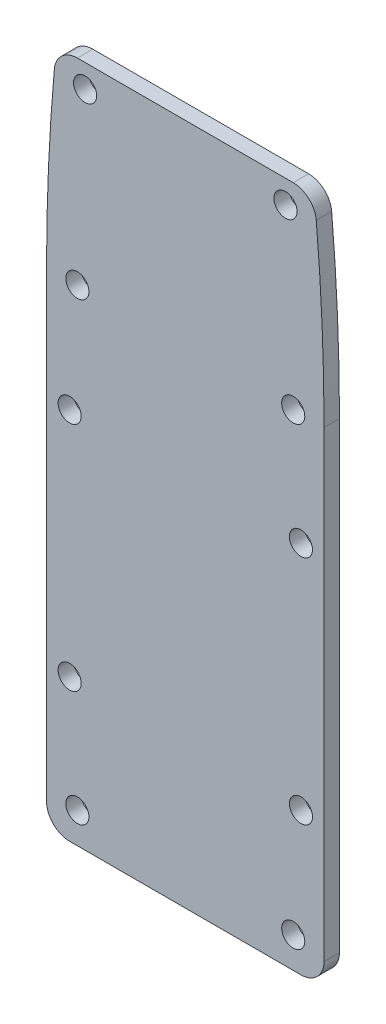
ISO-10303-21;
HEADER;
FILE_DESCRIPTION(('STEP AP214'),'2;1');
FILE_NAME('part.step','',(''),(''),'','','');
FILE_SCHEMA(('AUTOMOTIVE_DESIGN { 1 0 10303 214 1 1 1 1 }'));
ENDSEC;
DATA;
#1=APPLICATION_CONTEXT('core data for automotive mechanical design processes');
#2=APPLICATION_PROTOCOL_DEFINITION('international standard','automotive_design',2000,#1);
#3=PRODUCT_CONTEXT('',#1,'mechanical');
#4=PRODUCT('Part','Part','',(#3));
#5=PRODUCT_RELATED_PRODUCT_CATEGORY('part','',(#4));
#6=PRODUCT_DEFINITION_FORMATION('','',#4);
#7=PRODUCT_DEFINITION_CONTEXT('part definition',#1,'design');
#8=PRODUCT_DEFINITION('design','',#6,#7);
#9=PRODUCT_DEFINITION_SHAPE('','',#8);
#10=(LENGTH_UNIT() NAMED_UNIT(*) SI_UNIT(.MILLI.,.METRE.));
#11=(NAMED_UNIT(*) PLANE_ANGLE_UNIT() SI_UNIT($,.RADIAN.));
#12=(NAMED_UNIT(*) SI_UNIT($,.STERADIAN.) SOLID_ANGLE_UNIT());
#13=UNCERTAINTY_MEASURE_WITH_UNIT(LENGTH_MEASURE(1.E-05),#10,'distance_accuracy_value','');
#14=(GEOMETRIC_REPRESENTATION_CONTEXT(3) GLOBAL_UNCERTAINTY_ASSIGNED_CONTEXT((#13)) GLOBAL_UNIT_ASSIGNED_CONTEXT((#10,
#11,#12)) REPRESENTATION_CONTEXT('',''));
#15=CARTESIAN_POINT('',(0.,0.,0.));
#16=DIRECTION('',(0.,0.,1.));
#17=DIRECTION('',(1.,0.,0.));
#18=AXIS2_PLACEMENT_3D('',#15,#16,#17);
#19=CARTESIAN_POINT('',(238.624999999994,29.5000000000001,2.));
#20=DIRECTION('',(0.,0.,-1.));
#21=DIRECTION('',(-1.,0.,0.));
#22=AXIS2_PLACEMENT_3D('',#19,#20,#21);
#23=PLANE('',#22);
#24=DIRECTION('',(1.,0.,0.));
#25=VECTOR('',#24,1.);
#26=CARTESIAN_POINT('',(-18.,-33.5,2.));
#27=LINE('',#26,#25);
#28=CARTESIAN_POINT('',(-15.,-33.5,2.));
#29=VERTEX_POINT('',#28);
#30=CARTESIAN_POINT('',(15.,-33.5,2.));
#31=VERTEX_POINT('',#30);
#32=EDGE_CURVE('E129',#29,#31,#27,.T.);
#33=ORIENTED_EDGE('',*,*,#32,.T.);
#34=CARTESIAN_POINT('',(15.,-30.5,2.));
#35=DIRECTION('',(0.,0.,-1.));
#36=DIRECTION('',(-1.,0.,0.));
#37=AXIS2_PLACEMENT_3D('',#34,#35,#36);
#38=CIRCLE('',#37,3.);
#39=CARTESIAN_POINT('',(18.,-30.5,2.));
#40=VERTEX_POINT('',#39);
#41=EDGE_CURVE('E52',#31,#40,#38,.F.);
#42=ORIENTED_EDGE('',*,*,#41,.T.);
#43=DIRECTION('',(0.,1.,0.));
#44=VECTOR('',#43,1.);
#45=CARTESIAN_POINT('',(18.,29.5,2.));
#46=LINE('',#45,#44);
#47=CARTESIAN_POINT('',(18.,29.5,2.));
#48=VERTEX_POINT('',#47);
#49=EDGE_CURVE('E175',#40,#48,#46,.T.);
#50=ORIENTED_EDGE('',*,*,#49,.T.);
#51=CARTESIAN_POINT('',(-238.624999999994,29.5000000000001,2.));
#52=DIRECTION('',(0.,0.,1.));
#53=DIRECTION('',(1.,0.,0.));
#54=AXIS2_PLACEMENT_3D('',#51,#52,#53);
#55=CIRCLE('',#54,256.624999999994);
#56=CARTESIAN_POINT('',(16.9881715130605,52.2661409561361,2.));
#57=VERTEX_POINT('',#56);
#58=EDGE_CURVE('E184',#48,#57,#55,.T.);
#59=ORIENTED_EDGE('',*,*,#58,.T.);
#60=CARTESIAN_POINT('',(14.,52.,2.));
#61=DIRECTION('',(0.,0.,1.));
#62=DIRECTION('',(-1.,0.,0.));
#63=AXIS2_PLACEMENT_3D('',#60,#61,#62);
#64=CIRCLE('',#63,2.99999999999996);
#65=CARTESIAN_POINT('',(14.,55.,2.));
#66=VERTEX_POINT('',#65);
#67=EDGE_CURVE('E234',#57,#66,#64,.T.);
#68=ORIENTED_EDGE('',*,*,#67,.T.);
#69=DIRECTION('',(-1.,0.,0.));
#70=VECTOR('',#69,1.);
#71=CARTESIAN_POINT('',(-14.,55.,2.));
#72=LINE('',#71,#70);
#73=CARTESIAN_POINT('',(-14.,55.,2.));
#74=VERTEX_POINT('',#73);
#75=EDGE_CURVE('E245',#66,#74,#72,.T.);
#76=ORIENTED_EDGE('',*,*,#75,.T.);
#77=CARTESIAN_POINT('',(-14.,52.,2.));
#78=DIRECTION('',(0.,0.,1.));
#79=DIRECTION('',(1.,0.,0.));
#80=AXIS2_PLACEMENT_3D('',#77,#78,#79);
#81=CIRCLE('',#80,2.99999999999996);
#82=CARTESIAN_POINT('',(-16.9881715130606,52.266140956136,2.));
#83=VERTEX_POINT('',#82);
#84=EDGE_CURVE('E135',#74,#83,#81,.T.);
#85=ORIENTED_EDGE('',*,*,#84,.T.);
#86=CARTESIAN_POINT('',(238.624999999994,29.5000000000001,2.));
#87=DIRECTION('',(0.,0.,1.));
#88=DIRECTION('',(-1.,0.,0.));
#89=AXIS2_PLACEMENT_3D('',#86,#87,#88);
#90=CIRCLE('',#89,256.624999999994);
#91=CARTESIAN_POINT('',(-18.,29.5,2.));
#92=VERTEX_POINT('',#91);
#93=EDGE_CURVE('E130',#83,#92,#90,.T.);
#94=ORIENTED_EDGE('',*,*,#93,.T.);
#95=DIRECTION('',(0.,-1.,0.));
#96=VECTOR('',#95,1.);
#97=CARTESIAN_POINT('',(-18.,29.5,2.));
#98=LINE('',#97,#96);
#99=CARTESIAN_POINT('',(-18.,-30.5,2.));
#100=VERTEX_POINT('',#99);
#101=EDGE_CURVE('E120',#92,#100,#98,.T.);
#102=ORIENTED_EDGE('',*,*,#101,.T.);
#103=CARTESIAN_POINT('',(-15.,-30.5,2.));
#104=DIRECTION('',(0.,0.,-1.));
#105=DIRECTION('',(-1.,0.,0.));
#106=AXIS2_PLACEMENT_3D('',#103,#104,#105);
#107=CIRCLE('',#106,3.);
#108=EDGE_CURVE('E170',#100,#29,#107,.F.);
#109=ORIENTED_EDGE('',*,*,#108,.T.);
#110=EDGE_LOOP('',(#33,#42,#50,#59,#68,#76,#85,#94,#102,#109));
#111=FACE_BOUND('',#110,.T.);
#112=CARTESIAN_POINT('',(14.,29.5,2.));
#113=DIRECTION('',(0.,0.,1.));
#114=DIRECTION('',(1.,0.,0.));
#115=AXIS2_PLACEMENT_3D('',#112,#113,#114);
#116=CIRCLE('',#115,1.5);
#117=CARTESIAN_POINT('',(15.5,29.5,2.));
#118=VERTEX_POINT('',#117);
#119=EDGE_CURVE('E251',#118,#118,#116,.T.);
#120=ORIENTED_EDGE('',*,*,#119,.F.);
#121=EDGE_LOOP('',(#120));
#122=FACE_BOUND('',#121,.T.);
#123=CARTESIAN_POINT('',(-13.,52.,2.));
#124=DIRECTION('',(0.,0.,1.));
#125=DIRECTION('',(1.,0.,0.));
#126=AXIS2_PLACEMENT_3D('',#123,#124,#125);
#127=CIRCLE('',#126,1.5);
#128=CARTESIAN_POINT('',(-11.5,52.,2.));
#129=VERTEX_POINT('',#128);
#130=EDGE_CURVE('E260',#129,#129,#127,.T.);
#131=ORIENTED_EDGE('',*,*,#130,.F.);
#132=EDGE_LOOP('',(#131));
#133=FACE_BOUND('',#132,.T.);
#134=CARTESIAN_POINT('',(-14.,29.5,2.));
#135=DIRECTION('',(0.,0.,1.));
#136=DIRECTION('',(1.,0.,0.));
#137=AXIS2_PLACEMENT_3D('',#134,#135,#136);
#138=CIRCLE('',#137,1.5);
#139=CARTESIAN_POINT('',(-12.5,29.5,2.));
#140=VERTEX_POINT('',#139);
#141=EDGE_CURVE('E550',#140,#140,#138,.T.);
#142=ORIENTED_EDGE('',*,*,#141,.F.);
#143=EDGE_LOOP('',(#142));
#144=FACE_BOUND('',#143,.T.);
#145=CARTESIAN_POINT('',(-14.,-29.5,2.));
#146=DIRECTION('',(0.,0.,1.));
#147=DIRECTION('',(1.,0.,0.));
#148=AXIS2_PLACEMENT_3D('',#145,#146,#147);
#149=CIRCLE('',#148,1.5);
#150=CARTESIAN_POINT('',(-12.5,-29.5,2.));
#151=VERTEX_POINT('',#150);
#152=EDGE_CURVE('E542',#151,#151,#149,.T.);
#153=ORIENTED_EDGE('',*,*,#152,.F.);
#154=EDGE_LOOP('',(#153));
#155=FACE_BOUND('',#154,.T.);
#156=CARTESIAN_POINT('',(14.,-29.5,2.));
#157=DIRECTION('',(0.,0.,1.));
#158=DIRECTION('',(1.,0.,0.));
#159=AXIS2_PLACEMENT_3D('',#156,#157,#158);
#160=CIRCLE('',#159,1.5);
#161=CARTESIAN_POINT('',(15.5,-29.5,2.));
#162=VERTEX_POINT('',#161);
#163=EDGE_CURVE('E534',#162,#162,#160,.T.);
#164=ORIENTED_EDGE('',*,*,#163,.F.);
#165=EDGE_LOOP('',(#164));
#166=FACE_BOUND('',#165,.T.);
#167=CARTESIAN_POINT('',(15.,14.9999999999999,2.));
#168=DIRECTION('',(0.,0.,1.));
#169=DIRECTION('',(1.,0.,0.));
#170=AXIS2_PLACEMENT_3D('',#167,#168,#169);
#171=CIRCLE('',#170,1.5);
#172=CARTESIAN_POINT('',(16.5,14.9999999999999,2.));
#173=VERTEX_POINT('',#172);
#174=EDGE_CURVE('E526',#173,#173,#171,.T.);
#175=ORIENTED_EDGE('',*,*,#174,.F.);
#176=EDGE_LOOP('',(#175));
#177=FACE_BOUND('',#176,.T.);
#178=CARTESIAN_POINT('',(13.,52.,2.));
#179=DIRECTION('',(0.,0.,1.));
#180=DIRECTION('',(1.,0.,0.));
#181=AXIS2_PLACEMENT_3D('',#178,#179,#180);
#182=CIRCLE('',#181,1.5);
#183=CARTESIAN_POINT('',(14.5,52.,2.));
#184=VERTEX_POINT('',#183);
#185=EDGE_CURVE('E518',#184,#184,#182,.T.);
#186=ORIENTED_EDGE('',*,*,#185,.F.);
#187=EDGE_LOOP('',(#186));
#188=FACE_BOUND('',#187,.T.);
#189=CARTESIAN_POINT('',(14.9999999999999,-15.,2.));
#190=DIRECTION('',(0.,0.,1.));
#191=DIRECTION('',(1.,0.,0.));
#192=AXIS2_PLACEMENT_3D('',#189,#190,#191);
#193=CIRCLE('',#192,1.5);
#194=CARTESIAN_POINT('',(16.5,-15.,2.));
#195=VERTEX_POINT('',#194);
#196=EDGE_CURVE('E510',#195,#195,#193,.T.);
#197=ORIENTED_EDGE('',*,*,#196,.F.);
#198=EDGE_LOOP('',(#197));
#199=FACE_BOUND('',#198,.T.);
#200=CARTESIAN_POINT('',(-15.,-14.9999999999999,2.));
#201=DIRECTION('',(0.,0.,1.));
#202=DIRECTION('',(1.,0.,0.));
#203=AXIS2_PLACEMENT_3D('',#200,#201,#202);
#204=CIRCLE('',#203,1.5);
#205=CARTESIAN_POINT('',(-13.5,-14.9999999999999,2.));
#206=VERTEX_POINT('',#205);
#207=EDGE_CURVE('E502',#206,#206,#204,.T.);
#208=ORIENTED_EDGE('',*,*,#207,.F.);
#209=EDGE_LOOP('',(#208));
#210=FACE_BOUND('',#209,.T.);
#211=CARTESIAN_POINT('',(-15.,15.,2.));
#212=DIRECTION('',(0.,0.,1.));
#213=DIRECTION('',(1.,0.,0.));
#214=AXIS2_PLACEMENT_3D('',#211,#212,#213);
#215=CIRCLE('',#214,1.5);
#216=CARTESIAN_POINT('',(-13.5,15.,2.));
#217=VERTEX_POINT('',#216);
#218=EDGE_CURVE('E491',#217,#217,#215,.T.);
#219=ORIENTED_EDGE('',*,*,#218,.F.);
#220=EDGE_LOOP('',(#219));
#221=FACE_BOUND('',#220,.T.);
#222=ADVANCED_FACE('F43',(#111,#122,#133,#144,#155,#166,#177,#188,#199,#210,#221),#23,.F.);
#223=CARTESIAN_POINT('',(238.624999999994,29.5000000000001,0.));
#224=DIRECTION('',(0.,0.,-1.));
#225=DIRECTION('',(-1.,0.,0.));
#226=AXIS2_PLACEMENT_3D('',#223,#224,#225);
#227=PLANE('',#226);
#228=CARTESIAN_POINT('',(-15.,-14.9999999999999,0.));
#229=DIRECTION('',(0.,0.,1.));
#230=DIRECTION('',(1.,0.,0.));
#231=AXIS2_PLACEMENT_3D('',#228,#229,#230);
#232=CIRCLE('',#231,1.5);
#233=CARTESIAN_POINT('',(-13.5,-14.9999999999999,0.));
#234=VERTEX_POINT('',#233);
#235=EDGE_CURVE('E499',#234,#234,#232,.T.);
#236=ORIENTED_EDGE('',*,*,#235,.T.);
#237=EDGE_LOOP('',(#236));
#238=FACE_BOUND('',#237,.T.);
#239=CARTESIAN_POINT('',(13.,52.,0.));
#240=DIRECTION('',(0.,0.,1.));
#241=DIRECTION('',(1.,0.,0.));
#242=AXIS2_PLACEMENT_3D('',#239,#240,#241);
#243=CIRCLE('',#242,1.5);
#244=CARTESIAN_POINT('',(14.5,52.,0.));
#245=VERTEX_POINT('',#244);
#246=EDGE_CURVE('E514',#245,#245,#243,.T.);
#247=ORIENTED_EDGE('',*,*,#246,.T.);
#248=EDGE_LOOP('',(#247));
#249=FACE_BOUND('',#248,.T.);
#250=CARTESIAN_POINT('',(14.,-29.5,0.));
#251=DIRECTION('',(0.,0.,1.));
#252=DIRECTION('',(1.,0.,0.));
#253=AXIS2_PLACEMENT_3D('',#250,#251,#252);
#254=CIRCLE('',#253,1.5);
#255=CARTESIAN_POINT('',(15.5,-29.5,0.));
#256=VERTEX_POINT('',#255);
#257=EDGE_CURVE('E530',#256,#256,#254,.T.);
#258=ORIENTED_EDGE('',*,*,#257,.T.);
#259=EDGE_LOOP('',(#258));
#260=FACE_BOUND('',#259,.T.);
#261=CARTESIAN_POINT('',(-14.,29.5,0.));
#262=DIRECTION('',(0.,0.,1.));
#263=DIRECTION('',(1.,0.,0.));
#264=AXIS2_PLACEMENT_3D('',#261,#262,#263);
#265=CIRCLE('',#264,1.5);
#266=CARTESIAN_POINT('',(-12.5,29.5,0.));
#267=VERTEX_POINT('',#266);
#268=EDGE_CURVE('E546',#267,#267,#265,.T.);
#269=ORIENTED_EDGE('',*,*,#268,.T.);
#270=EDGE_LOOP('',(#269));
#271=FACE_BOUND('',#270,.T.);
#272=CARTESIAN_POINT('',(14.,29.5,0.));
#273=DIRECTION('',(0.,0.,1.));
#274=DIRECTION('',(1.,0.,0.));
#275=AXIS2_PLACEMENT_3D('',#272,#273,#274);
#276=CIRCLE('',#275,1.5);
#277=CARTESIAN_POINT('',(15.5,29.5,0.));
#278=VERTEX_POINT('',#277);
#279=EDGE_CURVE('E254',#278,#278,#276,.T.);
#280=ORIENTED_EDGE('',*,*,#279,.T.);
#281=EDGE_LOOP('',(#280));
#282=FACE_BOUND('',#281,.T.);
#283=DIRECTION('',(0.,1.,0.));
#284=VECTOR('',#283,1.);
#285=CARTESIAN_POINT('',(18.,29.5,0.));
#286=LINE('',#285,#284);
#287=CARTESIAN_POINT('',(18.,-30.5,0.));
#288=VERTEX_POINT('',#287);
#289=CARTESIAN_POINT('',(18.,29.5,0.));
#290=VERTEX_POINT('',#289);
#291=EDGE_CURVE('E193',#288,#290,#286,.T.);
#292=ORIENTED_EDGE('',*,*,#291,.F.);
#293=CARTESIAN_POINT('',(15.,-30.5,0.));
#294=DIRECTION('',(0.,0.,-1.));
#295=DIRECTION('',(-1.,0.,0.));
#296=AXIS2_PLACEMENT_3D('',#293,#294,#295);
#297=CIRCLE('',#296,3.);
#298=CARTESIAN_POINT('',(15.,-33.5,0.));
#299=VERTEX_POINT('',#298);
#300=EDGE_CURVE('E161',#288,#299,#297,.T.);
#301=ORIENTED_EDGE('',*,*,#300,.T.);
#302=DIRECTION('',(1.,0.,0.));
#303=VECTOR('',#302,1.);
#304=CARTESIAN_POINT('',(-18.,-33.5,0.));
#305=LINE('',#304,#303);
#306=CARTESIAN_POINT('',(-15.,-33.5,0.));
#307=VERTEX_POINT('',#306);
#308=EDGE_CURVE('E191',#307,#299,#305,.T.);
#309=ORIENTED_EDGE('',*,*,#308,.F.);
#310=CARTESIAN_POINT('',(-15.,-30.5,0.));
#311=DIRECTION('',(0.,0.,-1.));
#312=DIRECTION('',(-1.,0.,0.));
#313=AXIS2_PLACEMENT_3D('',#310,#311,#312);
#314=CIRCLE('',#313,3.);
#315=CARTESIAN_POINT('',(-18.,-30.5,0.));
#316=VERTEX_POINT('',#315);
#317=EDGE_CURVE('E152',#307,#316,#314,.T.);
#318=ORIENTED_EDGE('',*,*,#317,.T.);
#319=DIRECTION('',(0.,-1.,0.));
#320=VECTOR('',#319,1.);
#321=CARTESIAN_POINT('',(-18.,29.5,0.));
#322=LINE('',#321,#320);
#323=CARTESIAN_POINT('',(-18.,29.5,0.));
#324=VERTEX_POINT('',#323);
#325=EDGE_CURVE('E197',#324,#316,#322,.T.);
#326=ORIENTED_EDGE('',*,*,#325,.F.);
#327=CARTESIAN_POINT('',(238.624999999994,29.5000000000001,0.));
#328=DIRECTION('',(0.,0.,1.));
#329=DIRECTION('',(-1.,0.,0.));
#330=AXIS2_PLACEMENT_3D('',#327,#328,#329);
#331=CIRCLE('',#330,256.624999999994);
#332=CARTESIAN_POINT('',(-16.9881715130606,52.266140956136,0.));
#333=VERTEX_POINT('',#332);
#334=EDGE_CURVE('E144',#333,#324,#331,.T.);
#335=ORIENTED_EDGE('',*,*,#334,.F.);
#336=CARTESIAN_POINT('',(-14.,52.,0.));
#337=DIRECTION('',(0.,0.,1.));
#338=DIRECTION('',(1.,0.,0.));
#339=AXIS2_PLACEMENT_3D('',#336,#337,#338);
#340=CIRCLE('',#339,2.99999999999996);
#341=CARTESIAN_POINT('',(-14.,55.,0.));
#342=VERTEX_POINT('',#341);
#343=EDGE_CURVE('E140',#342,#333,#340,.T.);
#344=ORIENTED_EDGE('',*,*,#343,.F.);
#345=DIRECTION('',(-1.,0.,0.));
#346=VECTOR('',#345,1.);
#347=CARTESIAN_POINT('',(-14.,55.,0.));
#348=LINE('',#347,#346);
#349=CARTESIAN_POINT('',(14.,55.,0.));
#350=VERTEX_POINT('',#349);
#351=EDGE_CURVE('E211',#350,#342,#348,.T.);
#352=ORIENTED_EDGE('',*,*,#351,.F.);
#353=CARTESIAN_POINT('',(14.,52.,0.));
#354=DIRECTION('',(0.,0.,1.));
#355=DIRECTION('',(-1.,0.,0.));
#356=AXIS2_PLACEMENT_3D('',#353,#354,#355);
#357=CIRCLE('',#356,2.99999999999996);
#358=CARTESIAN_POINT('',(16.9881715130605,52.2661409561361,0.));
#359=VERTEX_POINT('',#358);
#360=EDGE_CURVE('E208',#359,#350,#357,.T.);
#361=ORIENTED_EDGE('',*,*,#360,.F.);
#362=CARTESIAN_POINT('',(-238.624999999994,29.5000000000001,0.));
#363=DIRECTION('',(0.,0.,1.));
#364=DIRECTION('',(1.,0.,0.));
#365=AXIS2_PLACEMENT_3D('',#362,#363,#364);
#366=CIRCLE('',#365,256.624999999994);
#367=EDGE_CURVE('E201',#290,#359,#366,.T.);
#368=ORIENTED_EDGE('',*,*,#367,.F.);
#369=EDGE_LOOP('',(#292,#301,#309,#318,#326,#335,#344,#352,#361,#368));
#370=FACE_BOUND('',#369,.T.);
#371=CARTESIAN_POINT('',(-13.,52.,0.));
#372=DIRECTION('',(0.,0.,1.));
#373=DIRECTION('',(1.,0.,0.));
#374=AXIS2_PLACEMENT_3D('',#371,#372,#373);
#375=CIRCLE('',#374,1.5);
#376=CARTESIAN_POINT('',(-11.5,52.,0.));
#377=VERTEX_POINT('',#376);
#378=EDGE_CURVE('E263',#377,#377,#375,.T.);
#379=ORIENTED_EDGE('',*,*,#378,.T.);
#380=EDGE_LOOP('',(#379));
#381=FACE_BOUND('',#380,.T.);
#382=CARTESIAN_POINT('',(-14.,-29.5,0.));
#383=DIRECTION('',(0.,0.,1.));
#384=DIRECTION('',(1.,0.,0.));
#385=AXIS2_PLACEMENT_3D('',#382,#383,#384);
#386=CIRCLE('',#385,1.5);
#387=CARTESIAN_POINT('',(-12.5,-29.5,0.));
#388=VERTEX_POINT('',#387);
#389=EDGE_CURVE('E538',#388,#388,#386,.T.);
#390=ORIENTED_EDGE('',*,*,#389,.T.);
#391=EDGE_LOOP('',(#390));
#392=FACE_BOUND('',#391,.T.);
#393=CARTESIAN_POINT('',(15.,14.9999999999999,0.));
#394=DIRECTION('',(0.,0.,1.));
#395=DIRECTION('',(1.,0.,0.));
#396=AXIS2_PLACEMENT_3D('',#393,#394,#395);
#397=CIRCLE('',#396,1.5);
#398=CARTESIAN_POINT('',(16.5,14.9999999999999,0.));
#399=VERTEX_POINT('',#398);
#400=EDGE_CURVE('E522',#399,#399,#397,.T.);
#401=ORIENTED_EDGE('',*,*,#400,.T.);
#402=EDGE_LOOP('',(#401));
#403=FACE_BOUND('',#402,.T.);
#404=CARTESIAN_POINT('',(14.9999999999999,-15.,0.));
#405=DIRECTION('',(0.,0.,1.));
#406=DIRECTION('',(1.,0.,0.));
#407=AXIS2_PLACEMENT_3D('',#404,#405,#406);
#408=CIRCLE('',#407,1.5);
#409=CARTESIAN_POINT('',(16.5,-15.,0.));
#410=VERTEX_POINT('',#409);
#411=EDGE_CURVE('E506',#410,#410,#408,.T.);
#412=ORIENTED_EDGE('',*,*,#411,.T.);
#413=EDGE_LOOP('',(#412));
#414=FACE_BOUND('',#413,.T.);
#415=CARTESIAN_POINT('',(-15.,15.,0.));
#416=DIRECTION('',(0.,0.,1.));
#417=DIRECTION('',(1.,0.,0.));
#418=AXIS2_PLACEMENT_3D('',#415,#416,#417);
#419=CIRCLE('',#418,1.5);
#420=CARTESIAN_POINT('',(-13.5,15.,0.));
#421=VERTEX_POINT('',#420);
#422=EDGE_CURVE('E494',#421,#421,#419,.T.);
#423=ORIENTED_EDGE('',*,*,#422,.T.);
#424=EDGE_LOOP('',(#423));
#425=FACE_BOUND('',#424,.T.);
#426=ADVANCED_FACE('F189',(#238,#249,#260,#271,#282,#370,#381,#392,#403,#414,#425),#227,.T.);
#427=CARTESIAN_POINT('',(238.624999999994,29.5000000000001,2.));
#428=DIRECTION('',(0.,0.,-1.));
#429=DIRECTION('',(-1.,0.,0.));
#430=AXIS2_PLACEMENT_3D('',#427,#428,#429);
#431=CYLINDRICAL_SURFACE('',#430,256.624999999994);
#432=ORIENTED_EDGE('',*,*,#334,.T.);
#433=DIRECTION('',(0.,0.,-1.));
#434=VECTOR('',#433,1.);
#435=CARTESIAN_POINT('',(-18.,29.5,2.));
#436=LINE('',#435,#434);
#437=EDGE_CURVE('E124',#92,#324,#436,.T.);
#438=ORIENTED_EDGE('',*,*,#437,.F.);
#439=ORIENTED_EDGE('',*,*,#93,.F.);
#440=DIRECTION('',(0.,0.,-1.));
#441=VECTOR('',#440,1.);
#442=CARTESIAN_POINT('',(-16.9881715130606,52.266140956136,2.));
#443=LINE('',#442,#441);
#444=EDGE_CURVE('E216',#83,#333,#443,.T.);
#445=ORIENTED_EDGE('',*,*,#444,.T.);
#446=EDGE_LOOP('',(#432,#438,#439,#445));
#447=FACE_BOUND('',#446,.T.);
#448=ADVANCED_FACE('F142',(#447),#431,.T.);
#449=CARTESIAN_POINT('',(-18.,29.5,2.));
#450=DIRECTION('',(1.,0.,0.));
#451=DIRECTION('',(0.,1.,0.));
#452=AXIS2_PLACEMENT_3D('',#449,#450,#451);
#453=PLANE('',#452);
#454=ORIENTED_EDGE('',*,*,#325,.T.);
#455=DIRECTION('',(0.,0.,-1.));
#456=VECTOR('',#455,1.);
#457=CARTESIAN_POINT('',(-18.,-30.5,2.));
#458=LINE('',#457,#456);
#459=EDGE_CURVE('E11',#316,#100,#458,.F.);
#460=ORIENTED_EDGE('',*,*,#459,.T.);
#461=ORIENTED_EDGE('',*,*,#101,.F.);
#462=ORIENTED_EDGE('',*,*,#437,.T.);
#463=EDGE_LOOP('',(#454,#460,#461,#462));
#464=FACE_BOUND('',#463,.T.);
#465=ADVANCED_FACE('F122',(#464),#453,.F.);
#466=CARTESIAN_POINT('',(-18.,-33.5,2.));
#467=DIRECTION('',(0.,1.,0.));
#468=DIRECTION('',(0.,0.,1.));
#469=AXIS2_PLACEMENT_3D('',#466,#467,#468);
#470=PLANE('',#469);
#471=ORIENTED_EDGE('',*,*,#308,.T.);
#472=DIRECTION('',(0.,0.,-1.));
#473=VECTOR('',#472,1.);
#474=CARTESIAN_POINT('',(15.,-33.5,2.));
#475=LINE('',#474,#473);
#476=EDGE_CURVE('E65',#299,#31,#475,.F.);
#477=ORIENTED_EDGE('',*,*,#476,.T.);
#478=ORIENTED_EDGE('',*,*,#32,.F.);
#479=DIRECTION('',(0.,0.,-1.));
#480=VECTOR('',#479,1.);
#481=CARTESIAN_POINT('',(-15.,-33.5,2.));
#482=LINE('',#481,#480);
#483=EDGE_CURVE('E164',#29,#307,#482,.T.);
#484=ORIENTED_EDGE('',*,*,#483,.T.);
#485=EDGE_LOOP('',(#471,#477,#478,#484));
#486=FACE_BOUND('',#485,.T.);
#487=ADVANCED_FACE('F194',(#486),#470,.F.);
#488=CARTESIAN_POINT('',(18.,29.5,2.));
#489=DIRECTION('',(-1.,0.,0.));
#490=DIRECTION('',(0.,-1.,0.));
#491=AXIS2_PLACEMENT_3D('',#488,#489,#490);
#492=PLANE('',#491);
#493=ORIENTED_EDGE('',*,*,#49,.F.);
#494=DIRECTION('',(0.,0.,-1.));
#495=VECTOR('',#494,1.);
#496=CARTESIAN_POINT('',(18.,-30.5,2.));
#497=LINE('',#496,#495);
#498=EDGE_CURVE('E146',#40,#288,#497,.T.);
#499=ORIENTED_EDGE('',*,*,#498,.T.);
#500=ORIENTED_EDGE('',*,*,#291,.T.);
#501=DIRECTION('',(0.,0.,-1.));
#502=VECTOR('',#501,1.);
#503=CARTESIAN_POINT('',(18.,29.5,2.));
#504=LINE('',#503,#502);
#505=EDGE_CURVE('E147',#48,#290,#504,.T.);
#506=ORIENTED_EDGE('',*,*,#505,.F.);
#507=EDGE_LOOP('',(#493,#499,#500,#506));
#508=FACE_BOUND('',#507,.T.);
#509=ADVANCED_FACE('F180',(#508),#492,.F.);
#510=CARTESIAN_POINT('',(-238.624999999994,29.5000000000001,2.));
#511=DIRECTION('',(0.,0.,-1.));
#512=DIRECTION('',(-1.,0.,0.));
#513=AXIS2_PLACEMENT_3D('',#510,#511,#512);
#514=CYLINDRICAL_SURFACE('',#513,256.624999999994);
#515=ORIENTED_EDGE('',*,*,#367,.T.);
#516=DIRECTION('',(0.,0.,-1.));
#517=VECTOR('',#516,1.);
#518=CARTESIAN_POINT('',(16.9881715130605,52.2661409561361,2.));
#519=LINE('',#518,#517);
#520=EDGE_CURVE('E155',#57,#359,#519,.T.);
#521=ORIENTED_EDGE('',*,*,#520,.F.);
#522=ORIENTED_EDGE('',*,*,#58,.F.);
#523=ORIENTED_EDGE('',*,*,#505,.T.);
#524=EDGE_LOOP('',(#515,#521,#522,#523));
#525=FACE_BOUND('',#524,.T.);
#526=ADVANCED_FACE('F270',(#525),#514,.T.);
#527=CARTESIAN_POINT('',(14.,52.,2.));
#528=DIRECTION('',(0.,0.,-1.));
#529=DIRECTION('',(-1.,0.,0.));
#530=AXIS2_PLACEMENT_3D('',#527,#528,#529);
#531=CYLINDRICAL_SURFACE('',#530,2.99999999999996);
#532=ORIENTED_EDGE('',*,*,#360,.T.);
#533=DIRECTION('',(0.,0.,-1.));
#534=VECTOR('',#533,1.);
#535=CARTESIAN_POINT('',(14.,55.,2.));
#536=LINE('',#535,#534);
#537=EDGE_CURVE('E223',#66,#350,#536,.T.);
#538=ORIENTED_EDGE('',*,*,#537,.F.);
#539=ORIENTED_EDGE('',*,*,#67,.F.);
#540=ORIENTED_EDGE('',*,*,#520,.T.);
#541=EDGE_LOOP('',(#532,#538,#539,#540));
#542=FACE_BOUND('',#541,.T.);
#543=ADVANCED_FACE('F232',(#542),#531,.T.);
#544=CARTESIAN_POINT('',(-14.,55.,2.));
#545=DIRECTION('',(0.,-1.,0.));
#546=DIRECTION('',(0.,0.,-1.));
#547=AXIS2_PLACEMENT_3D('',#544,#545,#546);
#548=PLANE('',#547);
#549=ORIENTED_EDGE('',*,*,#351,.T.);
#550=DIRECTION('',(0.,0.,-1.));
#551=VECTOR('',#550,1.);
#552=CARTESIAN_POINT('',(-14.,55.,2.));
#553=LINE('',#552,#551);
#554=EDGE_CURVE('E219',#74,#342,#553,.T.);
#555=ORIENTED_EDGE('',*,*,#554,.F.);
#556=ORIENTED_EDGE('',*,*,#75,.F.);
#557=ORIENTED_EDGE('',*,*,#537,.T.);
#558=EDGE_LOOP('',(#549,#555,#556,#557));
#559=FACE_BOUND('',#558,.T.);
#560=ADVANCED_FACE('F240',(#559),#548,.F.);
#561=CARTESIAN_POINT('',(-14.,52.,2.));
#562=DIRECTION('',(0.,0.,-1.));
#563=DIRECTION('',(-1.,0.,0.));
#564=AXIS2_PLACEMENT_3D('',#561,#562,#563);
#565=CYLINDRICAL_SURFACE('',#564,2.99999999999996);
#566=ORIENTED_EDGE('',*,*,#343,.T.);
#567=ORIENTED_EDGE('',*,*,#444,.F.);
#568=ORIENTED_EDGE('',*,*,#84,.F.);
#569=ORIENTED_EDGE('',*,*,#554,.T.);
#570=EDGE_LOOP('',(#566,#567,#568,#569));
#571=FACE_BOUND('',#570,.T.);
#572=ADVANCED_FACE('F243',(#571),#565,.T.);
#573=CARTESIAN_POINT('',(14.,29.5,2.));
#574=DIRECTION('',(0.,0.,-1.));
#575=DIRECTION('',(-1.,0.,0.));
#576=AXIS2_PLACEMENT_3D('',#573,#574,#575);
#577=CYLINDRICAL_SURFACE('',#576,1.5);
#578=ORIENTED_EDGE('',*,*,#119,.T.);
#579=EDGE_LOOP('',(#578));
#580=FACE_BOUND('',#579,.T.);
#581=ORIENTED_EDGE('',*,*,#279,.F.);
#582=EDGE_LOOP('',(#581));
#583=FACE_BOUND('',#582,.T.);
#584=ADVANCED_FACE('F287',(#580,#583),#577,.F.);
#585=CARTESIAN_POINT('',(-13.,52.,2.));
#586=DIRECTION('',(0.,0.,-1.));
#587=DIRECTION('',(-1.,0.,0.));
#588=AXIS2_PLACEMENT_3D('',#585,#586,#587);
#589=CYLINDRICAL_SURFACE('',#588,1.5);
#590=ORIENTED_EDGE('',*,*,#130,.T.);
#591=EDGE_LOOP('',(#590));
#592=FACE_BOUND('',#591,.T.);
#593=ORIENTED_EDGE('',*,*,#378,.F.);
#594=EDGE_LOOP('',(#593));
#595=FACE_BOUND('',#594,.T.);
#596=ADVANCED_FACE('F305',(#592,#595),#589,.F.);
#597=CARTESIAN_POINT('',(-14.,29.5,2.));
#598=DIRECTION('',(0.,0.,-1.));
#599=DIRECTION('',(-1.,0.,0.));
#600=AXIS2_PLACEMENT_3D('',#597,#598,#599);
#601=CYLINDRICAL_SURFACE('',#600,1.5);
#602=ORIENTED_EDGE('',*,*,#141,.T.);
#603=EDGE_LOOP('',(#602));
#604=FACE_BOUND('',#603,.T.);
#605=ORIENTED_EDGE('',*,*,#268,.F.);
#606=EDGE_LOOP('',(#605));
#607=FACE_BOUND('',#606,.T.);
#608=ADVANCED_FACE('F310',(#604,#607),#601,.F.);
#609=CARTESIAN_POINT('',(-14.,-29.5,2.));
#610=DIRECTION('',(0.,0.,-1.));
#611=DIRECTION('',(-1.,0.,0.));
#612=AXIS2_PLACEMENT_3D('',#609,#610,#611);
#613=CYLINDRICAL_SURFACE('',#612,1.5);
#614=ORIENTED_EDGE('',*,*,#152,.T.);
#615=EDGE_LOOP('',(#614));
#616=FACE_BOUND('',#615,.T.);
#617=ORIENTED_EDGE('',*,*,#389,.F.);
#618=EDGE_LOOP('',(#617));
#619=FACE_BOUND('',#618,.T.);
#620=ADVANCED_FACE('F316',(#616,#619),#613,.F.);
#621=CARTESIAN_POINT('',(14.,-29.5,2.));
#622=DIRECTION('',(0.,0.,-1.));
#623=DIRECTION('',(-1.,0.,0.));
#624=AXIS2_PLACEMENT_3D('',#621,#622,#623);
#625=CYLINDRICAL_SURFACE('',#624,1.5);
#626=ORIENTED_EDGE('',*,*,#163,.T.);
#627=EDGE_LOOP('',(#626));
#628=FACE_BOUND('',#627,.T.);
#629=ORIENTED_EDGE('',*,*,#257,.F.);
#630=EDGE_LOOP('',(#629));
#631=FACE_BOUND('',#630,.T.);
#632=ADVANCED_FACE('F323',(#628,#631),#625,.F.);
#633=CARTESIAN_POINT('',(15.,14.9999999999999,2.));
#634=DIRECTION('',(0.,0.,-1.));
#635=DIRECTION('',(-1.,0.,0.));
#636=AXIS2_PLACEMENT_3D('',#633,#634,#635);
#637=CYLINDRICAL_SURFACE('',#636,1.5);
#638=ORIENTED_EDGE('',*,*,#174,.T.);
#639=EDGE_LOOP('',(#638));
#640=FACE_BOUND('',#639,.T.);
#641=ORIENTED_EDGE('',*,*,#400,.F.);
#642=EDGE_LOOP('',(#641));
#643=FACE_BOUND('',#642,.T.);
#644=ADVANCED_FACE('F330',(#640,#643),#637,.F.);
#645=CARTESIAN_POINT('',(13.,52.,2.));
#646=DIRECTION('',(0.,0.,-1.));
#647=DIRECTION('',(-1.,0.,0.));
#648=AXIS2_PLACEMENT_3D('',#645,#646,#647);
#649=CYLINDRICAL_SURFACE('',#648,1.5);
#650=ORIENTED_EDGE('',*,*,#185,.T.);
#651=EDGE_LOOP('',(#650));
#652=FACE_BOUND('',#651,.T.);
#653=ORIENTED_EDGE('',*,*,#246,.F.);
#654=EDGE_LOOP('',(#653));
#655=FACE_BOUND('',#654,.T.);
#656=ADVANCED_FACE('F337',(#652,#655),#649,.F.);
#657=CARTESIAN_POINT('',(14.9999999999999,-15.,2.));
#658=DIRECTION('',(0.,0.,-1.));
#659=DIRECTION('',(-1.,0.,0.));
#660=AXIS2_PLACEMENT_3D('',#657,#658,#659);
#661=CYLINDRICAL_SURFACE('',#660,1.5);
#662=ORIENTED_EDGE('',*,*,#196,.T.);
#663=EDGE_LOOP('',(#662));
#664=FACE_BOUND('',#663,.T.);
#665=ORIENTED_EDGE('',*,*,#411,.F.);
#666=EDGE_LOOP('',(#665));
#667=FACE_BOUND('',#666,.T.);
#668=ADVANCED_FACE('F344',(#664,#667),#661,.F.);
#669=CARTESIAN_POINT('',(-15.,-14.9999999999999,2.));
#670=DIRECTION('',(0.,0.,-1.));
#671=DIRECTION('',(-1.,0.,0.));
#672=AXIS2_PLACEMENT_3D('',#669,#670,#671);
#673=CYLINDRICAL_SURFACE('',#672,1.5);
#674=ORIENTED_EDGE('',*,*,#207,.T.);
#675=EDGE_LOOP('',(#674));
#676=FACE_BOUND('',#675,.T.);
#677=ORIENTED_EDGE('',*,*,#235,.F.);
#678=EDGE_LOOP('',(#677));
#679=FACE_BOUND('',#678,.T.);
#680=ADVANCED_FACE('F351',(#676,#679),#673,.F.);
#681=CARTESIAN_POINT('',(-15.,15.,2.));
#682=DIRECTION('',(0.,0.,-1.));
#683=DIRECTION('',(-1.,0.,0.));
#684=AXIS2_PLACEMENT_3D('',#681,#682,#683);
#685=CYLINDRICAL_SURFACE('',#684,1.5);
#686=ORIENTED_EDGE('',*,*,#218,.T.);
#687=EDGE_LOOP('',(#686));
#688=FACE_BOUND('',#687,.T.);
#689=ORIENTED_EDGE('',*,*,#422,.F.);
#690=EDGE_LOOP('',(#689));
#691=FACE_BOUND('',#690,.T.);
#692=ADVANCED_FACE('F358',(#688,#691),#685,.F.);
#693=CARTESIAN_POINT('',(15.,-30.5,2.));
#694=DIRECTION('',(0.,0.,-1.));
#695=DIRECTION('',(-1.,0.,0.));
#696=AXIS2_PLACEMENT_3D('',#693,#694,#695);
#697=CYLINDRICAL_SURFACE('',#696,3.);
#698=ORIENTED_EDGE('',*,*,#41,.F.);
#699=ORIENTED_EDGE('',*,*,#476,.F.);
#700=ORIENTED_EDGE('',*,*,#300,.F.);
#701=ORIENTED_EDGE('',*,*,#498,.F.);
#702=EDGE_LOOP('',(#698,#699,#700,#701));
#703=FACE_BOUND('',#702,.T.);
#704=ADVANCED_FACE('F186',(#703),#697,.T.);
#705=CARTESIAN_POINT('',(-15.,-30.5,2.));
#706=DIRECTION('',(0.,0.,-1.));
#707=DIRECTION('',(-1.,0.,0.));
#708=AXIS2_PLACEMENT_3D('',#705,#706,#707);
#709=CYLINDRICAL_SURFACE('',#708,3.);
#710=ORIENTED_EDGE('',*,*,#108,.F.);
#711=ORIENTED_EDGE('',*,*,#459,.F.);
#712=ORIENTED_EDGE('',*,*,#317,.F.);
#713=ORIENTED_EDGE('',*,*,#483,.F.);
#714=EDGE_LOOP('',(#710,#711,#712,#713));
#715=FACE_BOUND('',#714,.T.);
#716=ADVANCED_FACE('F45',(#715),#709,.T.);
#717=CLOSED_SHELL('',(#222,#426,#448,#465,#487,#509,#526,#543,#560,#572,#584,#596,#608,#620,
#632,#644,#656,#668,#680,#692,#704,#716));
#718=MANIFOLD_SOLID_BREP('B2',#717);
#719=ADVANCED_BREP_SHAPE_REPRESENTATION('',(#18,#718),#14);
#720=SHAPE_DEFINITION_REPRESENTATION(#9,#719);
ENDSEC;
END-ISO-10303-21;
